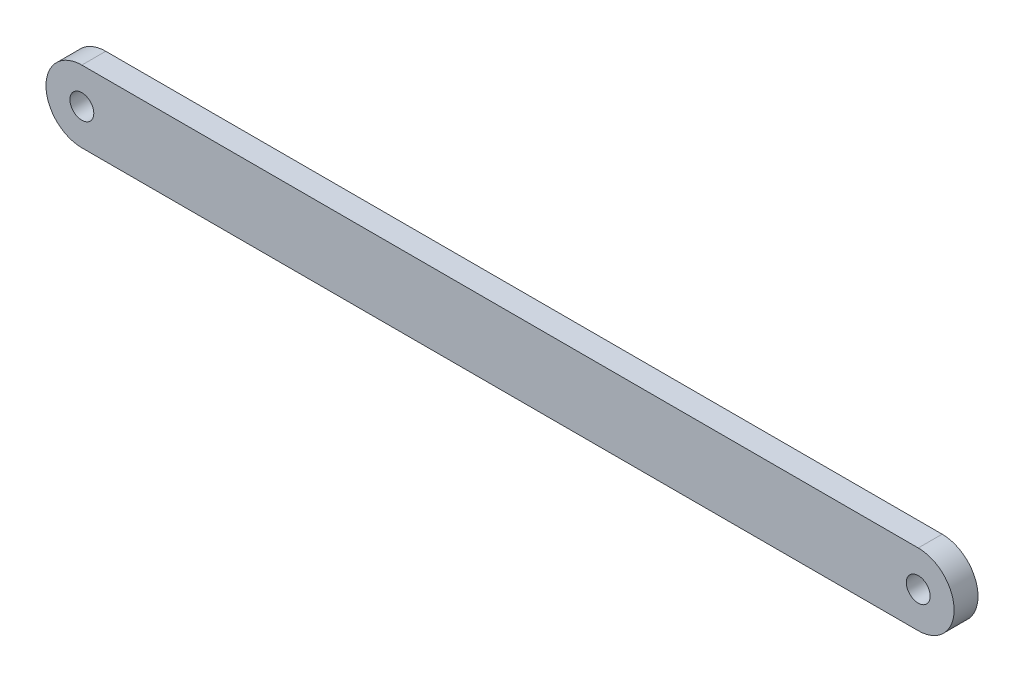
ISO-10303-21;
HEADER;
FILE_DESCRIPTION(('STEP AP214'),'2;1');
FILE_NAME('part.step','',(''),(''),'','','');
FILE_SCHEMA(('AUTOMOTIVE_DESIGN { 1 0 10303 214 1 1 1 1 }'));
ENDSEC;
DATA;
#1=APPLICATION_CONTEXT('core data for automotive mechanical design processes');
#2=APPLICATION_PROTOCOL_DEFINITION('international standard','automotive_design',2000,#1);
#3=PRODUCT_CONTEXT('',#1,'mechanical');
#4=PRODUCT('Part','Part','',(#3));
#5=PRODUCT_RELATED_PRODUCT_CATEGORY('part','',(#4));
#6=PRODUCT_DEFINITION_FORMATION('','',#4);
#7=PRODUCT_DEFINITION_CONTEXT('part definition',#1,'design');
#8=PRODUCT_DEFINITION('design','',#6,#7);
#9=PRODUCT_DEFINITION_SHAPE('','',#8);
#10=(LENGTH_UNIT() NAMED_UNIT(*) SI_UNIT(.MILLI.,.METRE.));
#11=(NAMED_UNIT(*) PLANE_ANGLE_UNIT() SI_UNIT($,.RADIAN.));
#12=(NAMED_UNIT(*) SI_UNIT($,.STERADIAN.) SOLID_ANGLE_UNIT());
#13=UNCERTAINTY_MEASURE_WITH_UNIT(LENGTH_MEASURE(1.E-05),#10,'distance_accuracy_value','');
#14=(GEOMETRIC_REPRESENTATION_CONTEXT(3) GLOBAL_UNCERTAINTY_ASSIGNED_CONTEXT((#13)) GLOBAL_UNIT_ASSIGNED_CONTEXT((#10,
#11,#12)) REPRESENTATION_CONTEXT('',''));
#15=CARTESIAN_POINT('',(0.,0.,0.));
#16=DIRECTION('',(0.,0.,1.));
#17=DIRECTION('',(1.,0.,0.));
#18=AXIS2_PLACEMENT_3D('',#15,#16,#17);
#19=CARTESIAN_POINT('',(-175.,0.,5.));
#20=DIRECTION('',(0.,0.,1.));
#21=DIRECTION('',(1.,0.,0.));
#22=AXIS2_PLACEMENT_3D('',#19,#20,#21);
#23=PLANE('',#22);
#24=CARTESIAN_POINT('',(175.,0.,5.));
#25=DIRECTION('',(0.,0.,1.));
#26=DIRECTION('',(1.,0.,0.));
#27=AXIS2_PLACEMENT_3D('',#24,#25,#26);
#28=CIRCLE('',#27,4.99999999999999);
#29=CARTESIAN_POINT('',(180.,0.,5.));
#30=VERTEX_POINT('',#29);
#31=EDGE_CURVE('E100',#30,#30,#28,.T.);
#32=ORIENTED_EDGE('',*,*,#31,.F.);
#33=EDGE_LOOP('',(#32));
#34=FACE_BOUND('',#33,.T.);
#35=CARTESIAN_POINT('',(-175.,0.,5.));
#36=DIRECTION('',(0.,0.,1.));
#37=DIRECTION('',(1.,0.,0.));
#38=AXIS2_PLACEMENT_3D('',#35,#36,#37);
#39=CIRCLE('',#38,15.0000000000001);
#40=CARTESIAN_POINT('',(-175.,15.0000000000001,5.));
#41=VERTEX_POINT('',#40);
#42=CARTESIAN_POINT('',(-175.,-15.0000000000001,5.));
#43=VERTEX_POINT('',#42);
#44=EDGE_CURVE('E85',#41,#43,#39,.T.);
#45=ORIENTED_EDGE('',*,*,#44,.T.);
#46=DIRECTION('',(1.,0.,0.));
#47=VECTOR('',#46,1.);
#48=CARTESIAN_POINT('',(-175.,-15.0000000000001,5.));
#49=LINE('',#48,#47);
#50=CARTESIAN_POINT('',(175.,-15.,5.));
#51=VERTEX_POINT('',#50);
#52=EDGE_CURVE('E80',#43,#51,#49,.T.);
#53=ORIENTED_EDGE('',*,*,#52,.T.);
#54=CARTESIAN_POINT('',(175.,0.,5.));
#55=DIRECTION('',(0.,0.,1.));
#56=DIRECTION('',(1.,0.,0.));
#57=AXIS2_PLACEMENT_3D('',#54,#55,#56);
#58=CIRCLE('',#57,15.0000000000001);
#59=CARTESIAN_POINT('',(175.,15.0000000000001,5.));
#60=VERTEX_POINT('',#59);
#61=EDGE_CURVE('E83',#51,#60,#58,.T.);
#62=ORIENTED_EDGE('',*,*,#61,.T.);
#63=DIRECTION('',(-1.,0.,0.));
#64=VECTOR('',#63,1.);
#65=CARTESIAN_POINT('',(-175.,15.0000000000001,5.));
#66=LINE('',#65,#64);
#67=EDGE_CURVE('E50',#60,#41,#66,.T.);
#68=ORIENTED_EDGE('',*,*,#67,.T.);
#69=EDGE_LOOP('',(#45,#53,#62,#68));
#70=FACE_BOUND('',#69,.T.);
#71=CARTESIAN_POINT('',(-175.,0.,5.));
#72=DIRECTION('',(0.,0.,1.));
#73=DIRECTION('',(1.,0.,0.));
#74=AXIS2_PLACEMENT_3D('',#71,#72,#73);
#75=CIRCLE('',#74,4.99999999999999);
#76=CARTESIAN_POINT('',(-170.,0.,5.));
#77=VERTEX_POINT('',#76);
#78=EDGE_CURVE('E115',#77,#77,#75,.T.);
#79=ORIENTED_EDGE('',*,*,#78,.F.);
#80=EDGE_LOOP('',(#79));
#81=FACE_BOUND('',#80,.T.);
#82=ADVANCED_FACE('F33',(#34,#70,#81),#23,.T.);
#83=CARTESIAN_POINT('',(-175.,0.,-5.));
#84=DIRECTION('',(0.,0.,1.));
#85=DIRECTION('',(1.,0.,0.));
#86=AXIS2_PLACEMENT_3D('',#83,#84,#85);
#87=PLANE('',#86);
#88=CARTESIAN_POINT('',(-175.,0.,-5.));
#89=DIRECTION('',(0.,0.,1.));
#90=DIRECTION('',(1.,0.,0.));
#91=AXIS2_PLACEMENT_3D('',#88,#89,#90);
#92=CIRCLE('',#91,15.0000000000001);
#93=CARTESIAN_POINT('',(-175.,15.0000000000001,-5.));
#94=VERTEX_POINT('',#93);
#95=CARTESIAN_POINT('',(-175.,-15.0000000000001,-5.));
#96=VERTEX_POINT('',#95);
#97=EDGE_CURVE('E97',#94,#96,#92,.T.);
#98=ORIENTED_EDGE('',*,*,#97,.F.);
#99=DIRECTION('',(-1.,0.,0.));
#100=VECTOR('',#99,1.);
#101=CARTESIAN_POINT('',(-175.,15.0000000000001,-5.));
#102=LINE('',#101,#100);
#103=CARTESIAN_POINT('',(175.,15.0000000000001,-5.));
#104=VERTEX_POINT('',#103);
#105=EDGE_CURVE('E73',#104,#94,#102,.T.);
#106=ORIENTED_EDGE('',*,*,#105,.F.);
#107=CARTESIAN_POINT('',(175.,0.,-5.));
#108=DIRECTION('',(0.,0.,1.));
#109=DIRECTION('',(1.,0.,0.));
#110=AXIS2_PLACEMENT_3D('',#107,#108,#109);
#111=CIRCLE('',#110,15.0000000000001);
#112=CARTESIAN_POINT('',(175.,-15.,-5.));
#113=VERTEX_POINT('',#112);
#114=EDGE_CURVE('E67',#113,#104,#111,.T.);
#115=ORIENTED_EDGE('',*,*,#114,.F.);
#116=DIRECTION('',(1.,0.,0.));
#117=VECTOR('',#116,1.);
#118=CARTESIAN_POINT('',(-175.,-15.0000000000001,-5.));
#119=LINE('',#118,#117);
#120=EDGE_CURVE('E89',#96,#113,#119,.T.);
#121=ORIENTED_EDGE('',*,*,#120,.F.);
#122=EDGE_LOOP('',(#98,#106,#115,#121));
#123=FACE_BOUND('',#122,.T.);
#124=CARTESIAN_POINT('',(175.,0.,-5.));
#125=DIRECTION('',(0.,0.,1.));
#126=DIRECTION('',(1.,0.,0.));
#127=AXIS2_PLACEMENT_3D('',#124,#125,#126);
#128=CIRCLE('',#127,4.99999999999999);
#129=CARTESIAN_POINT('',(180.,0.,-5.));
#130=VERTEX_POINT('',#129);
#131=EDGE_CURVE('E112',#130,#130,#128,.T.);
#132=ORIENTED_EDGE('',*,*,#131,.T.);
#133=EDGE_LOOP('',(#132));
#134=FACE_BOUND('',#133,.T.);
#135=CARTESIAN_POINT('',(-175.,0.,-5.));
#136=DIRECTION('',(0.,0.,1.));
#137=DIRECTION('',(1.,0.,0.));
#138=AXIS2_PLACEMENT_3D('',#135,#136,#137);
#139=CIRCLE('',#138,4.99999999999999);
#140=CARTESIAN_POINT('',(-170.,0.,-5.));
#141=VERTEX_POINT('',#140);
#142=EDGE_CURVE('E118',#141,#141,#139,.T.);
#143=ORIENTED_EDGE('',*,*,#142,.T.);
#144=EDGE_LOOP('',(#143));
#145=FACE_BOUND('',#144,.T.);
#146=ADVANCED_FACE('F108',(#123,#134,#145),#87,.F.);
#147=CARTESIAN_POINT('',(-175.,0.,5.));
#148=DIRECTION('',(0.,0.,-1.));
#149=DIRECTION('',(-1.,0.,0.));
#150=AXIS2_PLACEMENT_3D('',#147,#148,#149);
#151=CYLINDRICAL_SURFACE('',#150,15.0000000000001);
#152=ORIENTED_EDGE('',*,*,#97,.T.);
#153=DIRECTION('',(0.,0.,-1.));
#154=VECTOR('',#153,1.);
#155=CARTESIAN_POINT('',(-175.,-15.0000000000001,5.));
#156=LINE('',#155,#154);
#157=EDGE_CURVE('E11',#43,#96,#156,.T.);
#158=ORIENTED_EDGE('',*,*,#157,.F.);
#159=ORIENTED_EDGE('',*,*,#44,.F.);
#160=DIRECTION('',(0.,0.,-1.));
#161=VECTOR('',#160,1.);
#162=CARTESIAN_POINT('',(-175.,15.0000000000001,5.));
#163=LINE('',#162,#161);
#164=EDGE_CURVE('E93',#41,#94,#163,.T.);
#165=ORIENTED_EDGE('',*,*,#164,.T.);
#166=EDGE_LOOP('',(#152,#158,#159,#165));
#167=FACE_BOUND('',#166,.T.);
#168=ADVANCED_FACE('F35',(#167),#151,.T.);
#169=CARTESIAN_POINT('',(-175.,-15.0000000000001,5.));
#170=DIRECTION('',(0.,1.,0.));
#171=DIRECTION('',(-1.,0.,0.));
#172=AXIS2_PLACEMENT_3D('',#169,#170,#171);
#173=PLANE('',#172);
#174=ORIENTED_EDGE('',*,*,#120,.T.);
#175=DIRECTION('',(0.,0.,-1.));
#176=VECTOR('',#175,1.);
#177=CARTESIAN_POINT('',(175.,-15.,5.));
#178=LINE('',#177,#176);
#179=EDGE_CURVE('E42',#51,#113,#178,.T.);
#180=ORIENTED_EDGE('',*,*,#179,.F.);
#181=ORIENTED_EDGE('',*,*,#52,.F.);
#182=ORIENTED_EDGE('',*,*,#157,.T.);
#183=EDGE_LOOP('',(#174,#180,#181,#182));
#184=FACE_BOUND('',#183,.T.);
#185=ADVANCED_FACE('F88',(#184),#173,.F.);
#186=CARTESIAN_POINT('',(175.,0.,5.));
#187=DIRECTION('',(0.,0.,-1.));
#188=DIRECTION('',(-1.,0.,0.));
#189=AXIS2_PLACEMENT_3D('',#186,#187,#188);
#190=CYLINDRICAL_SURFACE('',#189,15.0000000000001);
#191=ORIENTED_EDGE('',*,*,#114,.T.);
#192=DIRECTION('',(0.,0.,-1.));
#193=VECTOR('',#192,1.);
#194=CARTESIAN_POINT('',(175.,15.0000000000001,5.));
#195=LINE('',#194,#193);
#196=EDGE_CURVE('E90',#60,#104,#195,.T.);
#197=ORIENTED_EDGE('',*,*,#196,.F.);
#198=ORIENTED_EDGE('',*,*,#61,.F.);
#199=ORIENTED_EDGE('',*,*,#179,.T.);
#200=EDGE_LOOP('',(#191,#197,#198,#199));
#201=FACE_BOUND('',#200,.T.);
#202=ADVANCED_FACE('F91',(#201),#190,.T.);
#203=CARTESIAN_POINT('',(-175.,15.0000000000001,5.));
#204=DIRECTION('',(0.,-1.,0.));
#205=DIRECTION('',(1.,0.,0.));
#206=AXIS2_PLACEMENT_3D('',#203,#204,#205);
#207=PLANE('',#206);
#208=ORIENTED_EDGE('',*,*,#105,.T.);
#209=ORIENTED_EDGE('',*,*,#164,.F.);
#210=ORIENTED_EDGE('',*,*,#67,.F.);
#211=ORIENTED_EDGE('',*,*,#196,.T.);
#212=EDGE_LOOP('',(#208,#209,#210,#211));
#213=FACE_BOUND('',#212,.T.);
#214=ADVANCED_FACE('F105',(#213),#207,.F.);
#215=CARTESIAN_POINT('',(175.,0.,5.));
#216=DIRECTION('',(0.,0.,-1.));
#217=DIRECTION('',(-1.,0.,0.));
#218=AXIS2_PLACEMENT_3D('',#215,#216,#217);
#219=CYLINDRICAL_SURFACE('',#218,4.99999999999999);
#220=ORIENTED_EDGE('',*,*,#31,.T.);
#221=EDGE_LOOP('',(#220));
#222=FACE_BOUND('',#221,.T.);
#223=ORIENTED_EDGE('',*,*,#131,.F.);
#224=EDGE_LOOP('',(#223));
#225=FACE_BOUND('',#224,.T.);
#226=ADVANCED_FACE('F135',(#222,#225),#219,.F.);
#227=CARTESIAN_POINT('',(-175.,0.,5.));
#228=DIRECTION('',(0.,0.,-1.));
#229=DIRECTION('',(-1.,0.,0.));
#230=AXIS2_PLACEMENT_3D('',#227,#228,#229);
#231=CYLINDRICAL_SURFACE('',#230,4.99999999999999);
#232=ORIENTED_EDGE('',*,*,#78,.T.);
#233=EDGE_LOOP('',(#232));
#234=FACE_BOUND('',#233,.T.);
#235=ORIENTED_EDGE('',*,*,#142,.F.);
#236=EDGE_LOOP('',(#235));
#237=FACE_BOUND('',#236,.T.);
#238=ADVANCED_FACE('F124',(#234,#237),#231,.F.);
#239=CLOSED_SHELL('',(#82,#146,#168,#185,#202,#214,#226,#238));
#240=MANIFOLD_SOLID_BREP('B2',#239);
#241=ADVANCED_BREP_SHAPE_REPRESENTATION('',(#18,#240),#14);
#242=SHAPE_DEFINITION_REPRESENTATION(#9,#241);
ENDSEC;
END-ISO-10303-21;
